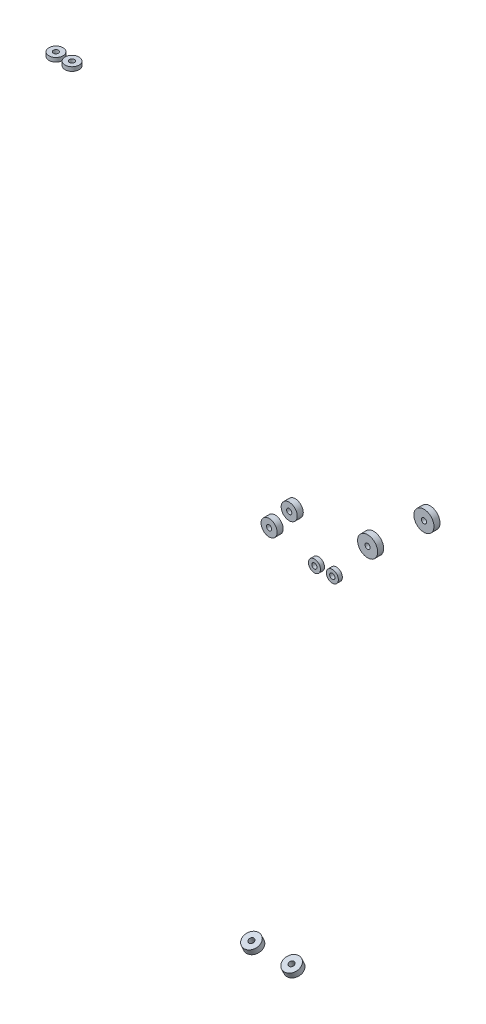
ISO-10303-21;
HEADER;
FILE_DESCRIPTION(('STEP AP214'),'2;1');
FILE_NAME('part.step','',(''),(''),'','','');
FILE_SCHEMA(('AUTOMOTIVE_DESIGN { 1 0 10303 214 1 1 1 1 }'));
ENDSEC;
DATA;
#1=APPLICATION_CONTEXT('core data for automotive mechanical design processes');
#2=APPLICATION_PROTOCOL_DEFINITION('international standard','automotive_design',2000,#1);
#3=PRODUCT_CONTEXT('',#1,'mechanical');
#4=PRODUCT('Part','Part','',(#3));
#5=PRODUCT_RELATED_PRODUCT_CATEGORY('part','',(#4));
#6=PRODUCT_DEFINITION_FORMATION('','',#4);
#7=PRODUCT_DEFINITION_CONTEXT('part definition',#1,'design');
#8=PRODUCT_DEFINITION('design','',#6,#7);
#9=PRODUCT_DEFINITION_SHAPE('','',#8);
#10=(LENGTH_UNIT() NAMED_UNIT(*) SI_UNIT(.MILLI.,.METRE.));
#11=(NAMED_UNIT(*) PLANE_ANGLE_UNIT() SI_UNIT($,.RADIAN.));
#12=(NAMED_UNIT(*) SI_UNIT($,.STERADIAN.) SOLID_ANGLE_UNIT());
#13=UNCERTAINTY_MEASURE_WITH_UNIT(LENGTH_MEASURE(1.E-05),#10,'distance_accuracy_value','');
#14=(GEOMETRIC_REPRESENTATION_CONTEXT(3) GLOBAL_UNCERTAINTY_ASSIGNED_CONTEXT((#13)) GLOBAL_UNIT_ASSIGNED_CONTEXT((#10,
#11,#12)) REPRESENTATION_CONTEXT('',''));
#15=CARTESIAN_POINT('',(0.,0.,0.));
#16=DIRECTION('',(0.,0.,1.));
#17=DIRECTION('',(1.,0.,0.));
#18=AXIS2_PLACEMENT_3D('',#15,#16,#17);
#19=CARTESIAN_POINT('',(60.555,36.81,126.));
#20=DIRECTION('',(0.,0.,1.));
#21=DIRECTION('',(1.,0.,0.));
#22=AXIS2_PLACEMENT_3D('',#19,#20,#21);
#23=PLANE('',#22);
#24=CARTESIAN_POINT('',(60.555,36.81,126.));
#25=DIRECTION('',(0.,0.,1.));
#26=DIRECTION('',(1.,0.,0.));
#27=AXIS2_PLACEMENT_3D('',#24,#25,#26);
#28=CIRCLE('',#27,1.3);
#29=CARTESIAN_POINT('',(61.855,36.81,126.));
#30=VERTEX_POINT('',#29);
#31=EDGE_CURVE('P0_E32',#30,#30,#28,.T.);
#32=ORIENTED_EDGE('',*,*,#31,.F.);
#33=EDGE_LOOP('',(#32));
#34=FACE_BOUND('',#33,.T.);
#35=CARTESIAN_POINT('',(60.555,36.81,126.));
#36=DIRECTION('',(0.,0.,-1.));
#37=DIRECTION('',(-1.,0.,0.));
#38=AXIS2_PLACEMENT_3D('',#35,#36,#37);
#39=CIRCLE('',#38,3.);
#40=CARTESIAN_POINT('',(57.555,36.81,126.));
#41=VERTEX_POINT('',#40);
#42=EDGE_CURVE('P0_E10',#41,#41,#39,.T.);
#43=ORIENTED_EDGE('',*,*,#42,.F.);
#44=EDGE_LOOP('',(#43));
#45=FACE_BOUND('',#44,.T.);
#46=ADVANCED_FACE('P0_F15',(#34,#45),#23,.T.);
#47=CARTESIAN_POINT('',(60.555,36.81,124.));
#48=DIRECTION('',(0.,0.,-1.));
#49=DIRECTION('',(-1.,0.,0.));
#50=AXIS2_PLACEMENT_3D('',#47,#48,#49);
#51=PLANE('',#50);
#52=CARTESIAN_POINT('',(60.555,36.81,124.));
#53=DIRECTION('',(0.,0.,-1.));
#54=DIRECTION('',(-1.,0.,0.));
#55=AXIS2_PLACEMENT_3D('',#52,#53,#54);
#56=CIRCLE('',#55,1.3);
#57=CARTESIAN_POINT('',(59.255,36.81,124.));
#58=VERTEX_POINT('',#57);
#59=EDGE_CURVE('P0_E19',#58,#58,#56,.T.);
#60=ORIENTED_EDGE('',*,*,#59,.F.);
#61=EDGE_LOOP('',(#60));
#62=FACE_BOUND('',#61,.T.);
#63=CARTESIAN_POINT('',(60.555,36.81,124.));
#64=DIRECTION('',(0.,0.,1.));
#65=DIRECTION('',(1.,0.,0.));
#66=AXIS2_PLACEMENT_3D('',#63,#64,#65);
#67=CIRCLE('',#66,3.);
#68=CARTESIAN_POINT('',(63.555,36.81,124.));
#69=VERTEX_POINT('',#68);
#70=EDGE_CURVE('P0_E24',#69,#69,#67,.T.);
#71=ORIENTED_EDGE('',*,*,#70,.F.);
#72=EDGE_LOOP('',(#71));
#73=FACE_BOUND('',#72,.T.);
#74=ADVANCED_FACE('P0_F43',(#62,#73),#51,.T.);
#75=CARTESIAN_POINT('',(60.555,36.81,124.));
#76=DIRECTION('',(0.,0.,1.));
#77=DIRECTION('',(1.,0.,0.));
#78=AXIS2_PLACEMENT_3D('',#75,#76,#77);
#79=CYLINDRICAL_SURFACE('',#78,3.);
#80=ORIENTED_EDGE('',*,*,#42,.T.);
#81=EDGE_LOOP('',(#80));
#82=FACE_BOUND('',#81,.T.);
#83=ORIENTED_EDGE('',*,*,#70,.T.);
#84=EDGE_LOOP('',(#83));
#85=FACE_BOUND('',#84,.T.);
#86=ADVANCED_FACE('P0_F17',(#82,#85),#79,.T.);
#87=CARTESIAN_POINT('',(60.555,36.81,123.99));
#88=DIRECTION('',(0.,0.,1.));
#89=DIRECTION('',(1.,0.,0.));
#90=AXIS2_PLACEMENT_3D('',#87,#88,#89);
#91=CYLINDRICAL_SURFACE('',#90,1.3);
#92=ORIENTED_EDGE('',*,*,#31,.T.);
#93=EDGE_LOOP('',(#92));
#94=FACE_BOUND('',#93,.T.);
#95=ORIENTED_EDGE('',*,*,#59,.T.);
#96=EDGE_LOOP('',(#95));
#97=FACE_BOUND('',#96,.T.);
#98=ADVANCED_FACE('P0_F41',(#94,#97),#91,.F.);
#99=CLOSED_SHELL('',(#46,#74,#86,#98));
#100=MANIFOLD_SOLID_BREP('P0_B1',#99);
#101=CARTESIAN_POINT('',(-60.,-54.,18.));
#102=DIRECTION('',(0.,0.,1.));
#103=DIRECTION('',(1.,0.,0.));
#104=AXIS2_PLACEMENT_3D('',#101,#102,#103);
#105=PLANE('',#104);
#106=CARTESIAN_POINT('',(-60.,-54.,18.));
#107=DIRECTION('',(0.,0.,1.));
#108=DIRECTION('',(1.,0.,0.));
#109=AXIS2_PLACEMENT_3D('',#106,#107,#108);
#110=CIRCLE('',#109,1.3);
#111=CARTESIAN_POINT('',(-58.7,-54.,18.));
#112=VERTEX_POINT('',#111);
#113=EDGE_CURVE('P1_E32',#112,#112,#110,.T.);
#114=ORIENTED_EDGE('',*,*,#113,.F.);
#115=EDGE_LOOP('',(#114));
#116=FACE_BOUND('',#115,.T.);
#117=CARTESIAN_POINT('',(-60.,-54.,18.));
#118=DIRECTION('',(0.,0.,-1.));
#119=DIRECTION('',(-1.,0.,0.));
#120=AXIS2_PLACEMENT_3D('',#117,#118,#119);
#121=CIRCLE('',#120,4.);
#122=CARTESIAN_POINT('',(-64.,-54.,18.));
#123=VERTEX_POINT('',#122);
#124=EDGE_CURVE('P1_E10',#123,#123,#121,.T.);
#125=ORIENTED_EDGE('',*,*,#124,.F.);
#126=EDGE_LOOP('',(#125));
#127=FACE_BOUND('',#126,.T.);
#128=ADVANCED_FACE('P1_F15',(#116,#127),#105,.T.);
#129=CARTESIAN_POINT('',(-60.,-54.,15.));
#130=DIRECTION('',(0.,0.,-1.));
#131=DIRECTION('',(-1.,0.,0.));
#132=AXIS2_PLACEMENT_3D('',#129,#130,#131);
#133=PLANE('',#132);
#134=CARTESIAN_POINT('',(-60.,-54.,15.));
#135=DIRECTION('',(0.,0.,-1.));
#136=DIRECTION('',(-1.,0.,0.));
#137=AXIS2_PLACEMENT_3D('',#134,#135,#136);
#138=CIRCLE('',#137,1.3);
#139=CARTESIAN_POINT('',(-61.3,-54.,15.));
#140=VERTEX_POINT('',#139);
#141=EDGE_CURVE('P1_E19',#140,#140,#138,.T.);
#142=ORIENTED_EDGE('',*,*,#141,.F.);
#143=EDGE_LOOP('',(#142));
#144=FACE_BOUND('',#143,.T.);
#145=CARTESIAN_POINT('',(-60.,-54.,15.));
#146=DIRECTION('',(0.,0.,1.));
#147=DIRECTION('',(1.,0.,0.));
#148=AXIS2_PLACEMENT_3D('',#145,#146,#147);
#149=CIRCLE('',#148,4.);
#150=CARTESIAN_POINT('',(-56.,-54.,15.));
#151=VERTEX_POINT('',#150);
#152=EDGE_CURVE('P1_E24',#151,#151,#149,.T.);
#153=ORIENTED_EDGE('',*,*,#152,.F.);
#154=EDGE_LOOP('',(#153));
#155=FACE_BOUND('',#154,.T.);
#156=ADVANCED_FACE('P1_F43',(#144,#155),#133,.T.);
#157=CARTESIAN_POINT('',(-60.,-54.,15.));
#158=DIRECTION('',(0.,0.,1.));
#159=DIRECTION('',(1.,0.,0.));
#160=AXIS2_PLACEMENT_3D('',#157,#158,#159);
#161=CYLINDRICAL_SURFACE('',#160,4.);
#162=ORIENTED_EDGE('',*,*,#124,.T.);
#163=EDGE_LOOP('',(#162));
#164=FACE_BOUND('',#163,.T.);
#165=ORIENTED_EDGE('',*,*,#152,.T.);
#166=EDGE_LOOP('',(#165));
#167=FACE_BOUND('',#166,.T.);
#168=ADVANCED_FACE('P1_F17',(#164,#167),#161,.T.);
#169=CARTESIAN_POINT('',(-60.,-54.,14.99));
#170=DIRECTION('',(0.,0.,1.));
#171=DIRECTION('',(1.,0.,0.));
#172=AXIS2_PLACEMENT_3D('',#169,#170,#171);
#173=CYLINDRICAL_SURFACE('',#172,1.3);
#174=ORIENTED_EDGE('',*,*,#113,.T.);
#175=EDGE_LOOP('',(#174));
#176=FACE_BOUND('',#175,.T.);
#177=ORIENTED_EDGE('',*,*,#141,.T.);
#178=EDGE_LOOP('',(#177));
#179=FACE_BOUND('',#178,.T.);
#180=ADVANCED_FACE('P1_F41',(#176,#179),#173,.F.);
#181=CLOSED_SHELL('',(#128,#156,#168,#180));
#182=MANIFOLD_SOLID_BREP('P1_B1',#181);
#183=CARTESIAN_POINT('',(69.445,36.81,126.));
#184=DIRECTION('',(0.,0.,1.));
#185=DIRECTION('',(1.,0.,0.));
#186=AXIS2_PLACEMENT_3D('',#183,#184,#185);
#187=PLANE('',#186);
#188=CARTESIAN_POINT('',(69.445,36.81,126.));
#189=DIRECTION('',(0.,0.,1.));
#190=DIRECTION('',(1.,0.,0.));
#191=AXIS2_PLACEMENT_3D('',#188,#189,#190);
#192=CIRCLE('',#191,1.3);
#193=CARTESIAN_POINT('',(70.745,36.81,126.));
#194=VERTEX_POINT('',#193);
#195=EDGE_CURVE('P2_E33',#194,#194,#192,.T.);
#196=ORIENTED_EDGE('',*,*,#195,.F.);
#197=EDGE_LOOP('',(#196));
#198=FACE_BOUND('',#197,.T.);
#199=CARTESIAN_POINT('',(69.445,36.81,126.));
#200=DIRECTION('',(0.,0.,-1.));
#201=DIRECTION('',(-1.,0.,0.));
#202=AXIS2_PLACEMENT_3D('',#199,#200,#201);
#203=CIRCLE('',#202,3.);
#204=CARTESIAN_POINT('',(66.445,36.81,126.));
#205=VERTEX_POINT('',#204);
#206=EDGE_CURVE('P2_E10',#205,#205,#203,.T.);
#207=ORIENTED_EDGE('',*,*,#206,.F.);
#208=EDGE_LOOP('',(#207));
#209=FACE_BOUND('',#208,.T.);
#210=ADVANCED_FACE('P2_F15',(#198,#209),#187,.T.);
#211=CARTESIAN_POINT('',(69.445,36.81,124.));
#212=DIRECTION('',(0.,0.,-1.));
#213=DIRECTION('',(-1.,0.,0.));
#214=AXIS2_PLACEMENT_3D('',#211,#212,#213);
#215=PLANE('',#214);
#216=CARTESIAN_POINT('',(69.445,36.81,124.));
#217=DIRECTION('',(0.,0.,-1.));
#218=DIRECTION('',(-1.,0.,0.));
#219=AXIS2_PLACEMENT_3D('',#216,#217,#218);
#220=CIRCLE('',#219,1.3);
#221=CARTESIAN_POINT('',(68.145,36.81,124.));
#222=VERTEX_POINT('',#221);
#223=EDGE_CURVE('P2_E19',#222,#222,#220,.T.);
#224=ORIENTED_EDGE('',*,*,#223,.F.);
#225=EDGE_LOOP('',(#224));
#226=FACE_BOUND('',#225,.T.);
#227=CARTESIAN_POINT('',(69.445,36.81,124.));
#228=DIRECTION('',(0.,0.,1.));
#229=DIRECTION('',(1.,0.,0.));
#230=AXIS2_PLACEMENT_3D('',#227,#228,#229);
#231=CIRCLE('',#230,3.);
#232=CARTESIAN_POINT('',(72.445,36.81,124.));
#233=VERTEX_POINT('',#232);
#234=EDGE_CURVE('P2_E24',#233,#233,#231,.T.);
#235=ORIENTED_EDGE('',*,*,#234,.F.);
#236=EDGE_LOOP('',(#235));
#237=FACE_BOUND('',#236,.T.);
#238=ADVANCED_FACE('P2_F43',(#226,#237),#215,.T.);
#239=CARTESIAN_POINT('',(69.445,36.81,124.));
#240=DIRECTION('',(0.,0.,1.));
#241=DIRECTION('',(1.,0.,0.));
#242=AXIS2_PLACEMENT_3D('',#239,#240,#241);
#243=CYLINDRICAL_SURFACE('',#242,3.);
#244=ORIENTED_EDGE('',*,*,#206,.T.);
#245=EDGE_LOOP('',(#244));
#246=FACE_BOUND('',#245,.T.);
#247=ORIENTED_EDGE('',*,*,#234,.T.);
#248=EDGE_LOOP('',(#247));
#249=FACE_BOUND('',#248,.T.);
#250=ADVANCED_FACE('P2_F17',(#246,#249),#243,.T.);
#251=CARTESIAN_POINT('',(69.445,36.81,123.99));
#252=DIRECTION('',(0.,0.,1.));
#253=DIRECTION('',(1.,0.,0.));
#254=AXIS2_PLACEMENT_3D('',#251,#252,#253);
#255=CYLINDRICAL_SURFACE('',#254,1.3);
#256=ORIENTED_EDGE('',*,*,#195,.T.);
#257=EDGE_LOOP('',(#256));
#258=FACE_BOUND('',#257,.T.);
#259=ORIENTED_EDGE('',*,*,#223,.T.);
#260=EDGE_LOOP('',(#259));
#261=FACE_BOUND('',#260,.T.);
#262=ADVANCED_FACE('P2_F41',(#258,#261),#255,.F.);
#263=CLOSED_SHELL('',(#210,#238,#250,#262));
#264=MANIFOLD_SOLID_BREP('P2_B1',#263);
#265=CARTESIAN_POINT('',(86.,57.5,125.));
#266=DIRECTION('',(0.,0.,1.));
#267=DIRECTION('',(1.,0.,0.));
#268=AXIS2_PLACEMENT_3D('',#265,#266,#267);
#269=PLANE('',#268);
#270=CARTESIAN_POINT('',(86.,57.5,125.));
#271=DIRECTION('',(0.,0.,1.));
#272=DIRECTION('',(1.,0.,0.));
#273=AXIS2_PLACEMENT_3D('',#270,#271,#272);
#274=CIRCLE('',#273,1.3);
#275=CARTESIAN_POINT('',(87.3,57.5,125.));
#276=VERTEX_POINT('',#275);
#277=EDGE_CURVE('P3_E33',#276,#276,#274,.T.);
#278=ORIENTED_EDGE('',*,*,#277,.F.);
#279=EDGE_LOOP('',(#278));
#280=FACE_BOUND('',#279,.T.);
#281=CARTESIAN_POINT('',(86.,57.5,125.));
#282=DIRECTION('',(0.,0.,-1.));
#283=DIRECTION('',(-1.,0.,0.));
#284=AXIS2_PLACEMENT_3D('',#281,#282,#283);
#285=CIRCLE('',#284,5.);
#286=CARTESIAN_POINT('',(81.,57.5,125.));
#287=VERTEX_POINT('',#286);
#288=EDGE_CURVE('P3_E10',#287,#287,#285,.T.);
#289=ORIENTED_EDGE('',*,*,#288,.F.);
#290=EDGE_LOOP('',(#289));
#291=FACE_BOUND('',#290,.T.);
#292=ADVANCED_FACE('P3_F15',(#280,#291),#269,.T.);
#293=CARTESIAN_POINT('',(86.,57.5,122.));
#294=DIRECTION('',(0.,0.,-1.));
#295=DIRECTION('',(-1.,0.,0.));
#296=AXIS2_PLACEMENT_3D('',#293,#294,#295);
#297=PLANE('',#296);
#298=CARTESIAN_POINT('',(86.,57.5,122.));
#299=DIRECTION('',(0.,0.,-1.));
#300=DIRECTION('',(-1.,0.,0.));
#301=AXIS2_PLACEMENT_3D('',#298,#299,#300);
#302=CIRCLE('',#301,1.3);
#303=CARTESIAN_POINT('',(84.7,57.5,122.));
#304=VERTEX_POINT('',#303);
#305=EDGE_CURVE('P3_E19',#304,#304,#302,.T.);
#306=ORIENTED_EDGE('',*,*,#305,.F.);
#307=EDGE_LOOP('',(#306));
#308=FACE_BOUND('',#307,.T.);
#309=CARTESIAN_POINT('',(86.,57.5,122.));
#310=DIRECTION('',(0.,0.,1.));
#311=DIRECTION('',(1.,0.,0.));
#312=AXIS2_PLACEMENT_3D('',#309,#310,#311);
#313=CIRCLE('',#312,5.);
#314=CARTESIAN_POINT('',(91.,57.5,122.));
#315=VERTEX_POINT('',#314);
#316=EDGE_CURVE('P3_E24',#315,#315,#313,.T.);
#317=ORIENTED_EDGE('',*,*,#316,.F.);
#318=EDGE_LOOP('',(#317));
#319=FACE_BOUND('',#318,.T.);
#320=ADVANCED_FACE('P3_F43',(#308,#319),#297,.T.);
#321=CARTESIAN_POINT('',(86.,57.5,122.));
#322=DIRECTION('',(0.,0.,1.));
#323=DIRECTION('',(1.,0.,0.));
#324=AXIS2_PLACEMENT_3D('',#321,#322,#323);
#325=CYLINDRICAL_SURFACE('',#324,5.);
#326=ORIENTED_EDGE('',*,*,#288,.T.);
#327=EDGE_LOOP('',(#326));
#328=FACE_BOUND('',#327,.T.);
#329=ORIENTED_EDGE('',*,*,#316,.T.);
#330=EDGE_LOOP('',(#329));
#331=FACE_BOUND('',#330,.T.);
#332=ADVANCED_FACE('P3_F17',(#328,#331),#325,.T.);
#333=CARTESIAN_POINT('',(86.,57.5,121.99));
#334=DIRECTION('',(0.,0.,1.));
#335=DIRECTION('',(1.,0.,0.));
#336=AXIS2_PLACEMENT_3D('',#333,#334,#335);
#337=CYLINDRICAL_SURFACE('',#336,1.3);
#338=ORIENTED_EDGE('',*,*,#277,.T.);
#339=EDGE_LOOP('',(#338));
#340=FACE_BOUND('',#339,.T.);
#341=ORIENTED_EDGE('',*,*,#305,.T.);
#342=EDGE_LOOP('',(#341));
#343=FACE_BOUND('',#342,.T.);
#344=ADVANCED_FACE('P3_F41',(#340,#343),#337,.F.);
#345=CLOSED_SHELL('',(#292,#320,#332,#344));
#346=MANIFOLD_SOLID_BREP('P3_B1',#345);
#347=CARTESIAN_POINT('',(114.,82.5,125.));
#348=DIRECTION('',(0.,0.,1.));
#349=DIRECTION('',(1.,0.,0.));
#350=AXIS2_PLACEMENT_3D('',#347,#348,#349);
#351=PLANE('',#350);
#352=CARTESIAN_POINT('',(114.,82.5,125.));
#353=DIRECTION('',(0.,0.,1.));
#354=DIRECTION('',(1.,0.,0.));
#355=AXIS2_PLACEMENT_3D('',#352,#353,#354);
#356=CIRCLE('',#355,1.3);
#357=CARTESIAN_POINT('',(115.3,82.5,125.));
#358=VERTEX_POINT('',#357);
#359=EDGE_CURVE('P4_E33',#358,#358,#356,.T.);
#360=ORIENTED_EDGE('',*,*,#359,.F.);
#361=EDGE_LOOP('',(#360));
#362=FACE_BOUND('',#361,.T.);
#363=CARTESIAN_POINT('',(114.,82.5,125.));
#364=DIRECTION('',(0.,0.,-1.));
#365=DIRECTION('',(-1.,0.,0.));
#366=AXIS2_PLACEMENT_3D('',#363,#364,#365);
#367=CIRCLE('',#366,5.);
#368=CARTESIAN_POINT('',(109.,82.5,125.));
#369=VERTEX_POINT('',#368);
#370=EDGE_CURVE('P4_E10',#369,#369,#367,.T.);
#371=ORIENTED_EDGE('',*,*,#370,.F.);
#372=EDGE_LOOP('',(#371));
#373=FACE_BOUND('',#372,.T.);
#374=ADVANCED_FACE('P4_F15',(#362,#373),#351,.T.);
#375=CARTESIAN_POINT('',(114.,82.5,122.));
#376=DIRECTION('',(0.,0.,-1.));
#377=DIRECTION('',(-1.,0.,0.));
#378=AXIS2_PLACEMENT_3D('',#375,#376,#377);
#379=PLANE('',#378);
#380=CARTESIAN_POINT('',(114.,82.5,122.));
#381=DIRECTION('',(0.,0.,-1.));
#382=DIRECTION('',(-1.,0.,0.));
#383=AXIS2_PLACEMENT_3D('',#380,#381,#382);
#384=CIRCLE('',#383,1.3);
#385=CARTESIAN_POINT('',(112.7,82.5,122.));
#386=VERTEX_POINT('',#385);
#387=EDGE_CURVE('P4_E19',#386,#386,#384,.T.);
#388=ORIENTED_EDGE('',*,*,#387,.F.);
#389=EDGE_LOOP('',(#388));
#390=FACE_BOUND('',#389,.T.);
#391=CARTESIAN_POINT('',(114.,82.5,122.));
#392=DIRECTION('',(0.,0.,1.));
#393=DIRECTION('',(1.,0.,0.));
#394=AXIS2_PLACEMENT_3D('',#391,#392,#393);
#395=CIRCLE('',#394,5.);
#396=CARTESIAN_POINT('',(119.,82.5,122.));
#397=VERTEX_POINT('',#396);
#398=EDGE_CURVE('P4_E24',#397,#397,#395,.T.);
#399=ORIENTED_EDGE('',*,*,#398,.F.);
#400=EDGE_LOOP('',(#399));
#401=FACE_BOUND('',#400,.T.);
#402=ADVANCED_FACE('P4_F43',(#390,#401),#379,.T.);
#403=CARTESIAN_POINT('',(114.,82.5,122.));
#404=DIRECTION('',(0.,0.,1.));
#405=DIRECTION('',(1.,0.,0.));
#406=AXIS2_PLACEMENT_3D('',#403,#404,#405);
#407=CYLINDRICAL_SURFACE('',#406,5.);
#408=ORIENTED_EDGE('',*,*,#370,.T.);
#409=EDGE_LOOP('',(#408));
#410=FACE_BOUND('',#409,.T.);
#411=ORIENTED_EDGE('',*,*,#398,.T.);
#412=EDGE_LOOP('',(#411));
#413=FACE_BOUND('',#412,.T.);
#414=ADVANCED_FACE('P4_F17',(#410,#413),#407,.T.);
#415=CARTESIAN_POINT('',(114.,82.5,121.99));
#416=DIRECTION('',(0.,0.,1.));
#417=DIRECTION('',(1.,0.,0.));
#418=AXIS2_PLACEMENT_3D('',#415,#416,#417);
#419=CYLINDRICAL_SURFACE('',#418,1.3);
#420=ORIENTED_EDGE('',*,*,#359,.T.);
#421=EDGE_LOOP('',(#420));
#422=FACE_BOUND('',#421,.T.);
#423=ORIENTED_EDGE('',*,*,#387,.T.);
#424=EDGE_LOOP('',(#423));
#425=FACE_BOUND('',#424,.T.);
#426=ADVANCED_FACE('P4_F41',(#422,#425),#419,.F.);
#427=CLOSED_SHELL('',(#374,#402,#414,#426));
#428=MANIFOLD_SOLID_BREP('P4_B1',#427);
#429=CARTESIAN_POINT('',(-10.,-182.155209837939,85.520481109965));
#430=DIRECTION('',(0.,-0.90630778703665,-0.422618261740699));
#431=DIRECTION('',(0.,0.422618261740699,-0.90630778703665));
#432=AXIS2_PLACEMENT_3D('',#429,#430,#431);
#433=PLANE('',#432);
#434=CARTESIAN_POINT('',(-10.,-182.155209837939,85.520481109965));
#435=DIRECTION('',(0.,-0.90630778703665,-0.422618261740699));
#436=DIRECTION('',(0.,0.422618261740699,-0.90630778703665));
#437=AXIS2_PLACEMENT_3D('',#434,#435,#436);
#438=CIRCLE('',#437,1.3);
#439=CARTESIAN_POINT('',(-10.,-181.605806097676,84.3422809868173));
#440=VERTEX_POINT('',#439);
#441=EDGE_CURVE('P5_E33',#440,#440,#438,.T.);
#442=ORIENTED_EDGE('',*,*,#441,.F.);
#443=EDGE_LOOP('',(#442));
#444=FACE_BOUND('',#443,.T.);
#445=CARTESIAN_POINT('',(-10.,-182.155209837939,85.520481109965));
#446=DIRECTION('',(0.,0.90630778703665,0.422618261740699));
#447=DIRECTION('',(0.,-0.422618261740699,0.90630778703665));
#448=AXIS2_PLACEMENT_3D('',#445,#446,#447);
#449=CIRCLE('',#448,4.);
#450=CARTESIAN_POINT('',(-10.,-183.845682884902,89.1457122581116));
#451=VERTEX_POINT('',#450);
#452=EDGE_CURVE('P5_E10',#451,#451,#449,.T.);
#453=ORIENTED_EDGE('',*,*,#452,.F.);
#454=EDGE_LOOP('',(#453));
#455=FACE_BOUND('',#454,.T.);
#456=ADVANCED_FACE('P5_F15',(#444,#455),#433,.T.);
#457=CARTESIAN_POINT('',(-10.,-179.436286476829,86.7883358951871));
#458=DIRECTION('',(0.,0.90630778703665,0.422618261740699));
#459=DIRECTION('',(0.,-0.422618261740699,0.90630778703665));
#460=AXIS2_PLACEMENT_3D('',#457,#458,#459);
#461=PLANE('',#460);
#462=CARTESIAN_POINT('',(-10.,-179.436286476829,86.7883358951871));
#463=DIRECTION('',(0.,0.90630778703665,0.422618261740699));
#464=DIRECTION('',(0.,-0.422618261740699,0.90630778703665));
#465=AXIS2_PLACEMENT_3D('',#462,#463,#464);
#466=CIRCLE('',#465,1.3);
#467=CARTESIAN_POINT('',(-10.,-179.985690217092,87.9665360183347));
#468=VERTEX_POINT('',#467);
#469=EDGE_CURVE('P5_E19',#468,#468,#466,.T.);
#470=ORIENTED_EDGE('',*,*,#469,.F.);
#471=EDGE_LOOP('',(#470));
#472=FACE_BOUND('',#471,.T.);
#473=CARTESIAN_POINT('',(-10.,-179.436286476829,86.7883358951871));
#474=DIRECTION('',(0.,-0.90630778703665,-0.422618261740699));
#475=DIRECTION('',(0.,0.422618261740699,-0.90630778703665));
#476=AXIS2_PLACEMENT_3D('',#473,#474,#475);
#477=CIRCLE('',#476,4.);
#478=CARTESIAN_POINT('',(-10.,-177.745813429866,83.1631047470405));
#479=VERTEX_POINT('',#478);
#480=EDGE_CURVE('P5_E24',#479,#479,#477,.T.);
#481=ORIENTED_EDGE('',*,*,#480,.F.);
#482=EDGE_LOOP('',(#481));
#483=FACE_BOUND('',#482,.T.);
#484=ADVANCED_FACE('P5_F43',(#472,#483),#461,.T.);
#485=CARTESIAN_POINT('',(-10.,-179.436286476829,86.7883358951871));
#486=DIRECTION('',(0.,-0.90630778703665,-0.422618261740699));
#487=DIRECTION('',(0.,0.422618261740699,-0.90630778703665));
#488=AXIS2_PLACEMENT_3D('',#485,#486,#487);
#489=CYLINDRICAL_SURFACE('',#488,4.);
#490=ORIENTED_EDGE('',*,*,#452,.T.);
#491=EDGE_LOOP('',(#490));
#492=FACE_BOUND('',#491,.T.);
#493=ORIENTED_EDGE('',*,*,#480,.T.);
#494=EDGE_LOOP('',(#493));
#495=FACE_BOUND('',#494,.T.);
#496=ADVANCED_FACE('P5_F17',(#492,#495),#489,.T.);
#497=CARTESIAN_POINT('',(-10.,-179.427223398959,86.7925620778045));
#498=DIRECTION('',(0.,-0.90630778703665,-0.422618261740699));
#499=DIRECTION('',(0.,0.422618261740699,-0.90630778703665));
#500=AXIS2_PLACEMENT_3D('',#497,#498,#499);
#501=CYLINDRICAL_SURFACE('',#500,1.3);
#502=ORIENTED_EDGE('',*,*,#441,.T.);
#503=EDGE_LOOP('',(#502));
#504=FACE_BOUND('',#503,.T.);
#505=ORIENTED_EDGE('',*,*,#469,.T.);
#506=EDGE_LOOP('',(#505));
#507=FACE_BOUND('',#506,.T.);
#508=ADVANCED_FACE('P5_F41',(#504,#507),#501,.F.);
#509=CLOSED_SHELL('',(#456,#484,#496,#508));
#510=MANIFOLD_SOLID_BREP('P5_B1',#509);
#511=CARTESIAN_POINT('',(10.,-182.155209837939,85.520481109965));
#512=DIRECTION('',(0.,-0.90630778703665,-0.422618261740699));
#513=DIRECTION('',(0.,0.422618261740699,-0.90630778703665));
#514=AXIS2_PLACEMENT_3D('',#511,#512,#513);
#515=PLANE('',#514);
#516=CARTESIAN_POINT('',(10.,-182.155209837939,85.520481109965));
#517=DIRECTION('',(0.,-0.90630778703665,-0.422618261740699));
#518=DIRECTION('',(0.,0.422618261740699,-0.90630778703665));
#519=AXIS2_PLACEMENT_3D('',#516,#517,#518);
#520=CIRCLE('',#519,1.3);
#521=CARTESIAN_POINT('',(10.,-181.605806097676,84.3422809868173));
#522=VERTEX_POINT('',#521);
#523=EDGE_CURVE('P6_E33',#522,#522,#520,.T.);
#524=ORIENTED_EDGE('',*,*,#523,.F.);
#525=EDGE_LOOP('',(#524));
#526=FACE_BOUND('',#525,.T.);
#527=CARTESIAN_POINT('',(10.,-182.155209837939,85.520481109965));
#528=DIRECTION('',(0.,0.90630778703665,0.422618261740699));
#529=DIRECTION('',(0.,-0.422618261740699,0.90630778703665));
#530=AXIS2_PLACEMENT_3D('',#527,#528,#529);
#531=CIRCLE('',#530,4.);
#532=CARTESIAN_POINT('',(10.,-183.845682884902,89.1457122581116));
#533=VERTEX_POINT('',#532);
#534=EDGE_CURVE('P6_E10',#533,#533,#531,.T.);
#535=ORIENTED_EDGE('',*,*,#534,.F.);
#536=EDGE_LOOP('',(#535));
#537=FACE_BOUND('',#536,.T.);
#538=ADVANCED_FACE('P6_F15',(#526,#537),#515,.T.);
#539=CARTESIAN_POINT('',(10.,-179.436286476829,86.7883358951871));
#540=DIRECTION('',(0.,0.90630778703665,0.422618261740699));
#541=DIRECTION('',(0.,-0.422618261740699,0.90630778703665));
#542=AXIS2_PLACEMENT_3D('',#539,#540,#541);
#543=PLANE('',#542);
#544=CARTESIAN_POINT('',(10.,-179.436286476829,86.7883358951871));
#545=DIRECTION('',(0.,0.90630778703665,0.422618261740699));
#546=DIRECTION('',(0.,-0.422618261740699,0.90630778703665));
#547=AXIS2_PLACEMENT_3D('',#544,#545,#546);
#548=CIRCLE('',#547,1.3);
#549=CARTESIAN_POINT('',(10.,-179.985690217092,87.9665360183347));
#550=VERTEX_POINT('',#549);
#551=EDGE_CURVE('P6_E19',#550,#550,#548,.T.);
#552=ORIENTED_EDGE('',*,*,#551,.F.);
#553=EDGE_LOOP('',(#552));
#554=FACE_BOUND('',#553,.T.);
#555=CARTESIAN_POINT('',(10.,-179.436286476829,86.7883358951871));
#556=DIRECTION('',(0.,-0.90630778703665,-0.422618261740699));
#557=DIRECTION('',(0.,0.422618261740699,-0.90630778703665));
#558=AXIS2_PLACEMENT_3D('',#555,#556,#557);
#559=CIRCLE('',#558,4.);
#560=CARTESIAN_POINT('',(10.,-177.745813429866,83.1631047470405));
#561=VERTEX_POINT('',#560);
#562=EDGE_CURVE('P6_E24',#561,#561,#559,.T.);
#563=ORIENTED_EDGE('',*,*,#562,.F.);
#564=EDGE_LOOP('',(#563));
#565=FACE_BOUND('',#564,.T.);
#566=ADVANCED_FACE('P6_F43',(#554,#565),#543,.T.);
#567=CARTESIAN_POINT('',(10.,-179.436286476829,86.7883358951871));
#568=DIRECTION('',(0.,-0.90630778703665,-0.422618261740699));
#569=DIRECTION('',(0.,0.422618261740699,-0.90630778703665));
#570=AXIS2_PLACEMENT_3D('',#567,#568,#569);
#571=CYLINDRICAL_SURFACE('',#570,4.);
#572=ORIENTED_EDGE('',*,*,#534,.T.);
#573=EDGE_LOOP('',(#572));
#574=FACE_BOUND('',#573,.T.);
#575=ORIENTED_EDGE('',*,*,#562,.T.);
#576=EDGE_LOOP('',(#575));
#577=FACE_BOUND('',#576,.T.);
#578=ADVANCED_FACE('P6_F17',(#574,#577),#571,.T.);
#579=CARTESIAN_POINT('',(10.,-179.427223398959,86.7925620778045));
#580=DIRECTION('',(0.,-0.90630778703665,-0.422618261740699));
#581=DIRECTION('',(0.,0.422618261740699,-0.90630778703665));
#582=AXIS2_PLACEMENT_3D('',#579,#580,#581);
#583=CYLINDRICAL_SURFACE('',#582,1.3);
#584=ORIENTED_EDGE('',*,*,#523,.T.);
#585=EDGE_LOOP('',(#584));
#586=FACE_BOUND('',#585,.T.);
#587=ORIENTED_EDGE('',*,*,#551,.T.);
#588=EDGE_LOOP('',(#587));
#589=FACE_BOUND('',#588,.T.);
#590=ADVANCED_FACE('P6_F41',(#586,#589),#583,.F.);
#591=CLOSED_SHELL('',(#538,#566,#578,#590));
#592=MANIFOLD_SOLID_BREP('P6_B1',#591);
#593=CARTESIAN_POINT('',(-126.,134.,68.));
#594=DIRECTION('',(0.,-1.,0.));
#595=DIRECTION('',(0.,0.,-1.));
#596=AXIS2_PLACEMENT_3D('',#593,#594,#595);
#597=PLANE('',#596);
#598=CARTESIAN_POINT('',(-126.,134.,68.));
#599=DIRECTION('',(0.,-1.,0.));
#600=DIRECTION('',(0.,0.,-1.));
#601=AXIS2_PLACEMENT_3D('',#598,#599,#600);
#602=CIRCLE('',#601,1.3);
#603=CARTESIAN_POINT('',(-126.,134.,66.7));
#604=VERTEX_POINT('',#603);
#605=EDGE_CURVE('P7_E33',#604,#604,#602,.T.);
#606=ORIENTED_EDGE('',*,*,#605,.F.);
#607=EDGE_LOOP('',(#606));
#608=FACE_BOUND('',#607,.T.);
#609=CARTESIAN_POINT('',(-126.,134.,68.));
#610=DIRECTION('',(0.,1.,0.));
#611=DIRECTION('',(0.,0.,1.));
#612=AXIS2_PLACEMENT_3D('',#609,#610,#611);
#613=CIRCLE('',#612,3.5);
#614=CARTESIAN_POINT('',(-126.,134.,71.5));
#615=VERTEX_POINT('',#614);
#616=EDGE_CURVE('P7_E10',#615,#615,#613,.T.);
#617=ORIENTED_EDGE('',*,*,#616,.F.);
#618=EDGE_LOOP('',(#617));
#619=FACE_BOUND('',#618,.T.);
#620=ADVANCED_FACE('P7_F15',(#608,#619),#597,.T.);
#621=CARTESIAN_POINT('',(-126.,136.,68.));
#622=DIRECTION('',(0.,1.,0.));
#623=DIRECTION('',(0.,0.,1.));
#624=AXIS2_PLACEMENT_3D('',#621,#622,#623);
#625=PLANE('',#624);
#626=CARTESIAN_POINT('',(-126.,136.,68.));
#627=DIRECTION('',(0.,1.,0.));
#628=DIRECTION('',(0.,0.,1.));
#629=AXIS2_PLACEMENT_3D('',#626,#627,#628);
#630=CIRCLE('',#629,1.3);
#631=CARTESIAN_POINT('',(-126.,136.,69.3));
#632=VERTEX_POINT('',#631);
#633=EDGE_CURVE('P7_E19',#632,#632,#630,.T.);
#634=ORIENTED_EDGE('',*,*,#633,.F.);
#635=EDGE_LOOP('',(#634));
#636=FACE_BOUND('',#635,.T.);
#637=CARTESIAN_POINT('',(-126.,136.,68.));
#638=DIRECTION('',(0.,-1.,0.));
#639=DIRECTION('',(0.,0.,-1.));
#640=AXIS2_PLACEMENT_3D('',#637,#638,#639);
#641=CIRCLE('',#640,3.5);
#642=CARTESIAN_POINT('',(-126.,136.,64.5));
#643=VERTEX_POINT('',#642);
#644=EDGE_CURVE('P7_E24',#643,#643,#641,.T.);
#645=ORIENTED_EDGE('',*,*,#644,.F.);
#646=EDGE_LOOP('',(#645));
#647=FACE_BOUND('',#646,.T.);
#648=ADVANCED_FACE('P7_F43',(#636,#647),#625,.T.);
#649=CARTESIAN_POINT('',(-126.,136.,68.));
#650=DIRECTION('',(0.,-1.,0.));
#651=DIRECTION('',(0.,0.,-1.));
#652=AXIS2_PLACEMENT_3D('',#649,#650,#651);
#653=CYLINDRICAL_SURFACE('',#652,3.5);
#654=ORIENTED_EDGE('',*,*,#616,.T.);
#655=EDGE_LOOP('',(#654));
#656=FACE_BOUND('',#655,.T.);
#657=ORIENTED_EDGE('',*,*,#644,.T.);
#658=EDGE_LOOP('',(#657));
#659=FACE_BOUND('',#658,.T.);
#660=ADVANCED_FACE('P7_F17',(#656,#659),#653,.T.);
#661=CARTESIAN_POINT('',(-126.,136.01,68.));
#662=DIRECTION('',(0.,-1.,0.));
#663=DIRECTION('',(0.,0.,-1.));
#664=AXIS2_PLACEMENT_3D('',#661,#662,#663);
#665=CYLINDRICAL_SURFACE('',#664,1.3);
#666=ORIENTED_EDGE('',*,*,#605,.T.);
#667=EDGE_LOOP('',(#666));
#668=FACE_BOUND('',#667,.T.);
#669=ORIENTED_EDGE('',*,*,#633,.T.);
#670=EDGE_LOOP('',(#669));
#671=FACE_BOUND('',#670,.T.);
#672=ADVANCED_FACE('P7_F41',(#668,#671),#665,.F.);
#673=CLOSED_SHELL('',(#620,#648,#660,#672));
#674=MANIFOLD_SOLID_BREP('P7_B1',#673);
#675=CARTESIAN_POINT('',(-118.,134.,68.));
#676=DIRECTION('',(0.,-1.,0.));
#677=DIRECTION('',(0.,0.,-1.));
#678=AXIS2_PLACEMENT_3D('',#675,#676,#677);
#679=PLANE('',#678);
#680=CARTESIAN_POINT('',(-118.,134.,68.));
#681=DIRECTION('',(0.,-1.,0.));
#682=DIRECTION('',(0.,0.,-1.));
#683=AXIS2_PLACEMENT_3D('',#680,#681,#682);
#684=CIRCLE('',#683,1.3);
#685=CARTESIAN_POINT('',(-118.,134.,66.7));
#686=VERTEX_POINT('',#685);
#687=EDGE_CURVE('P8_E33',#686,#686,#684,.T.);
#688=ORIENTED_EDGE('',*,*,#687,.F.);
#689=EDGE_LOOP('',(#688));
#690=FACE_BOUND('',#689,.T.);
#691=CARTESIAN_POINT('',(-118.,134.,68.));
#692=DIRECTION('',(0.,1.,0.));
#693=DIRECTION('',(0.,0.,1.));
#694=AXIS2_PLACEMENT_3D('',#691,#692,#693);
#695=CIRCLE('',#694,3.5);
#696=CARTESIAN_POINT('',(-118.,134.,71.5));
#697=VERTEX_POINT('',#696);
#698=EDGE_CURVE('P8_E10',#697,#697,#695,.T.);
#699=ORIENTED_EDGE('',*,*,#698,.F.);
#700=EDGE_LOOP('',(#699));
#701=FACE_BOUND('',#700,.T.);
#702=ADVANCED_FACE('P8_F15',(#690,#701),#679,.T.);
#703=CARTESIAN_POINT('',(-118.,136.,68.));
#704=DIRECTION('',(0.,1.,0.));
#705=DIRECTION('',(0.,0.,1.));
#706=AXIS2_PLACEMENT_3D('',#703,#704,#705);
#707=PLANE('',#706);
#708=CARTESIAN_POINT('',(-118.,136.,68.));
#709=DIRECTION('',(0.,1.,0.));
#710=DIRECTION('',(0.,0.,1.));
#711=AXIS2_PLACEMENT_3D('',#708,#709,#710);
#712=CIRCLE('',#711,1.3);
#713=CARTESIAN_POINT('',(-118.,136.,69.3));
#714=VERTEX_POINT('',#713);
#715=EDGE_CURVE('P8_E19',#714,#714,#712,.T.);
#716=ORIENTED_EDGE('',*,*,#715,.F.);
#717=EDGE_LOOP('',(#716));
#718=FACE_BOUND('',#717,.T.);
#719=CARTESIAN_POINT('',(-118.,136.,68.));
#720=DIRECTION('',(0.,-1.,0.));
#721=DIRECTION('',(0.,0.,-1.));
#722=AXIS2_PLACEMENT_3D('',#719,#720,#721);
#723=CIRCLE('',#722,3.5);
#724=CARTESIAN_POINT('',(-118.,136.,64.5));
#725=VERTEX_POINT('',#724);
#726=EDGE_CURVE('P8_E24',#725,#725,#723,.T.);
#727=ORIENTED_EDGE('',*,*,#726,.F.);
#728=EDGE_LOOP('',(#727));
#729=FACE_BOUND('',#728,.T.);
#730=ADVANCED_FACE('P8_F43',(#718,#729),#707,.T.);
#731=CARTESIAN_POINT('',(-118.,136.,68.));
#732=DIRECTION('',(0.,-1.,0.));
#733=DIRECTION('',(0.,0.,-1.));
#734=AXIS2_PLACEMENT_3D('',#731,#732,#733);
#735=CYLINDRICAL_SURFACE('',#734,3.5);
#736=ORIENTED_EDGE('',*,*,#698,.T.);
#737=EDGE_LOOP('',(#736));
#738=FACE_BOUND('',#737,.T.);
#739=ORIENTED_EDGE('',*,*,#726,.T.);
#740=EDGE_LOOP('',(#739));
#741=FACE_BOUND('',#740,.T.);
#742=ADVANCED_FACE('P8_F17',(#738,#741),#735,.T.);
#743=CARTESIAN_POINT('',(-118.,136.01,68.));
#744=DIRECTION('',(0.,-1.,0.));
#745=DIRECTION('',(0.,0.,-1.));
#746=AXIS2_PLACEMENT_3D('',#743,#744,#745);
#747=CYLINDRICAL_SURFACE('',#746,1.3);
#748=ORIENTED_EDGE('',*,*,#687,.T.);
#749=EDGE_LOOP('',(#748));
#750=FACE_BOUND('',#749,.T.);
#751=ORIENTED_EDGE('',*,*,#715,.T.);
#752=EDGE_LOOP('',(#751));
#753=FACE_BOUND('',#752,.T.);
#754=ADVANCED_FACE('P8_F41',(#750,#753),#747,.F.);
#755=CLOSED_SHELL('',(#702,#730,#742,#754));
#756=MANIFOLD_SOLID_BREP('P8_B1',#755);
#757=CARTESIAN_POINT('',(-70.,-66.,18.));
#758=DIRECTION('',(0.,0.,1.));
#759=DIRECTION('',(1.,0.,0.));
#760=AXIS2_PLACEMENT_3D('',#757,#758,#759);
#761=PLANE('',#760);
#762=CARTESIAN_POINT('',(-70.,-66.,18.));
#763=DIRECTION('',(0.,0.,1.));
#764=DIRECTION('',(1.,0.,0.));
#765=AXIS2_PLACEMENT_3D('',#762,#763,#764);
#766=CIRCLE('',#765,1.3);
#767=CARTESIAN_POINT('',(-68.7,-66.,18.));
#768=VERTEX_POINT('',#767);
#769=EDGE_CURVE('P9_E28',#768,#768,#766,.T.);
#770=ORIENTED_EDGE('',*,*,#769,.F.);
#771=EDGE_LOOP('',(#770));
#772=FACE_BOUND('',#771,.T.);
#773=CARTESIAN_POINT('',(-70.,-66.,18.));
#774=DIRECTION('',(0.,0.,-1.));
#775=DIRECTION('',(-1.,0.,0.));
#776=AXIS2_PLACEMENT_3D('',#773,#774,#775);
#777=CIRCLE('',#776,4.);
#778=CARTESIAN_POINT('',(-74.,-66.,18.));
#779=VERTEX_POINT('',#778);
#780=EDGE_CURVE('P9_E10',#779,#779,#777,.T.);
#781=ORIENTED_EDGE('',*,*,#780,.F.);
#782=EDGE_LOOP('',(#781));
#783=FACE_BOUND('',#782,.T.);
#784=ADVANCED_FACE('P9_F15',(#772,#783),#761,.T.);
#785=CARTESIAN_POINT('',(-70.,-66.,15.));
#786=DIRECTION('',(0.,0.,-1.));
#787=DIRECTION('',(-1.,0.,0.));
#788=AXIS2_PLACEMENT_3D('',#785,#786,#787);
#789=PLANE('',#788);
#790=CARTESIAN_POINT('',(-70.,-66.,15.));
#791=DIRECTION('',(0.,0.,-1.));
#792=DIRECTION('',(-1.,0.,0.));
#793=AXIS2_PLACEMENT_3D('',#790,#791,#792);
#794=CIRCLE('',#793,1.3);
#795=CARTESIAN_POINT('',(-71.3,-66.,15.));
#796=VERTEX_POINT('',#795);
#797=EDGE_CURVE('P9_E19',#796,#796,#794,.T.);
#798=ORIENTED_EDGE('',*,*,#797,.F.);
#799=EDGE_LOOP('',(#798));
#800=FACE_BOUND('',#799,.T.);
#801=CARTESIAN_POINT('',(-70.,-66.,15.));
#802=DIRECTION('',(0.,0.,1.));
#803=DIRECTION('',(1.,0.,0.));
#804=AXIS2_PLACEMENT_3D('',#801,#802,#803);
#805=CIRCLE('',#804,4.);
#806=CARTESIAN_POINT('',(-66.,-66.,15.));
#807=VERTEX_POINT('',#806);
#808=EDGE_CURVE('P9_E24',#807,#807,#805,.T.);
#809=ORIENTED_EDGE('',*,*,#808,.F.);
#810=EDGE_LOOP('',(#809));
#811=FACE_BOUND('',#810,.T.);
#812=ADVANCED_FACE('P9_F43',(#800,#811),#789,.T.);
#813=CARTESIAN_POINT('',(-70.,-66.,15.));
#814=DIRECTION('',(0.,0.,1.));
#815=DIRECTION('',(1.,0.,0.));
#816=AXIS2_PLACEMENT_3D('',#813,#814,#815);
#817=CYLINDRICAL_SURFACE('',#816,4.);
#818=ORIENTED_EDGE('',*,*,#780,.T.);
#819=EDGE_LOOP('',(#818));
#820=FACE_BOUND('',#819,.T.);
#821=ORIENTED_EDGE('',*,*,#808,.T.);
#822=EDGE_LOOP('',(#821));
#823=FACE_BOUND('',#822,.T.);
#824=ADVANCED_FACE('P9_F17',(#820,#823),#817,.T.);
#825=CARTESIAN_POINT('',(-70.,-66.,14.99));
#826=DIRECTION('',(0.,0.,1.));
#827=DIRECTION('',(1.,0.,0.));
#828=AXIS2_PLACEMENT_3D('',#825,#826,#827);
#829=CYLINDRICAL_SURFACE('',#828,1.3);
#830=ORIENTED_EDGE('',*,*,#769,.T.);
#831=EDGE_LOOP('',(#830));
#832=FACE_BOUND('',#831,.T.);
#833=ORIENTED_EDGE('',*,*,#797,.T.);
#834=EDGE_LOOP('',(#833));
#835=FACE_BOUND('',#834,.T.);
#836=ADVANCED_FACE('P9_F41',(#832,#835),#829,.F.);
#837=CLOSED_SHELL('',(#784,#812,#824,#836));
#838=MANIFOLD_SOLID_BREP('P9_B1',#837);
#839=ADVANCED_BREP_SHAPE_REPRESENTATION('',(#18,#100,#182,#264,#346,#428,#510,#592,#674,#756,
#838),#14);
#840=SHAPE_DEFINITION_REPRESENTATION(#9,#839);
ENDSEC;
END-ISO-10303-21;
